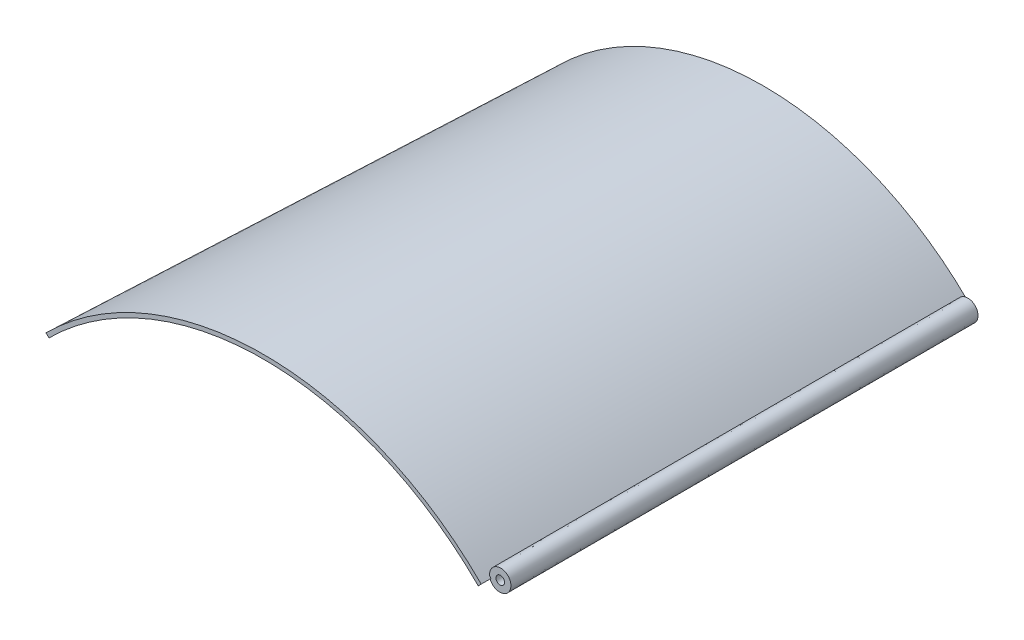
ISO-10303-21;
HEADER;
FILE_DESCRIPTION(('STEP AP214'),'2;1');
FILE_NAME('part.step','',(''),(''),'','','');
FILE_SCHEMA(('AUTOMOTIVE_DESIGN { 1 0 10303 214 1 1 1 1 }'));
ENDSEC;
DATA;
#1=APPLICATION_CONTEXT('core data for automotive mechanical design processes');
#2=APPLICATION_PROTOCOL_DEFINITION('international standard','automotive_design',2000,#1);
#3=PRODUCT_CONTEXT('',#1,'mechanical');
#4=PRODUCT('Part','Part','',(#3));
#5=PRODUCT_RELATED_PRODUCT_CATEGORY('part','',(#4));
#6=PRODUCT_DEFINITION_FORMATION('','',#4);
#7=PRODUCT_DEFINITION_CONTEXT('part definition',#1,'design');
#8=PRODUCT_DEFINITION('design','',#6,#7);
#9=PRODUCT_DEFINITION_SHAPE('','',#8);
#10=(LENGTH_UNIT() NAMED_UNIT(*) SI_UNIT(.MILLI.,.METRE.));
#11=(NAMED_UNIT(*) PLANE_ANGLE_UNIT() SI_UNIT($,.RADIAN.));
#12=(NAMED_UNIT(*) SI_UNIT($,.STERADIAN.) SOLID_ANGLE_UNIT());
#13=UNCERTAINTY_MEASURE_WITH_UNIT(LENGTH_MEASURE(1.E-05),#10,'distance_accuracy_value','');
#14=(GEOMETRIC_REPRESENTATION_CONTEXT(3) GLOBAL_UNCERTAINTY_ASSIGNED_CONTEXT((#13)) GLOBAL_UNIT_ASSIGNED_CONTEXT((#10,
#11,#12)) REPRESENTATION_CONTEXT('',''));
#15=CARTESIAN_POINT('',(0.,0.,0.));
#16=DIRECTION('',(0.,0.,1.));
#17=DIRECTION('',(1.,0.,0.));
#18=AXIS2_PLACEMENT_3D('',#15,#16,#17);
#19=CARTESIAN_POINT('',(-98.5933127144027,98.5933127144027,-120.));
#20=DIRECTION('',(0.,0.,-1.));
#21=DIRECTION('',(-1.,0.,0.));
#22=AXIS2_PLACEMENT_3D('',#19,#20,#21);
#23=PLANE('',#22);
#24=CARTESIAN_POINT('',(0.,0.,-120.));
#25=DIRECTION('',(0.,0.,-1.));
#26=DIRECTION('',(-1.,0.,0.));
#27=AXIS2_PLACEMENT_3D('',#24,#25,#26);
#28=CIRCLE('',#27,137.432);
#29=CARTESIAN_POINT('',(-97.1790991520296,97.1790991520296,-120.));
#30=VERTEX_POINT('',#29);
#31=CARTESIAN_POINT('',(97.1790991520296,97.1790991520296,-120.));
#32=VERTEX_POINT('',#31);
#33=EDGE_CURVE('E68',#30,#32,#28,.T.);
#34=ORIENTED_EDGE('',*,*,#33,.F.);
#35=DIRECTION('',(-0.707106781186548,0.707106781186548,0.));
#36=VECTOR('',#35,1.);
#37=CARTESIAN_POINT('',(-98.5933127144027,98.5933127144027,-120.));
#38=LINE('',#37,#36);
#39=CARTESIAN_POINT('',(-98.5933127144027,98.5933127144027,-120.));
#40=VERTEX_POINT('',#39);
#41=EDGE_CURVE('E209',#30,#40,#38,.T.);
#42=ORIENTED_EDGE('',*,*,#41,.T.);
#43=CARTESIAN_POINT('',(0.,0.,-120.));
#44=DIRECTION('',(0.,0.,-1.));
#45=DIRECTION('',(-1.,0.,0.));
#46=AXIS2_PLACEMENT_3D('',#43,#44,#45);
#47=CIRCLE('',#46,139.432);
#48=CARTESIAN_POINT('',(98.5933127144027,98.5933127144027,-120.));
#49=VERTEX_POINT('',#48);
#50=EDGE_CURVE('E208',#40,#49,#47,.T.);
#51=ORIENTED_EDGE('',*,*,#50,.T.);
#52=DIRECTION('',(0.707106781186548,0.707106781186548,0.));
#53=VECTOR('',#52,1.);
#54=CARTESIAN_POINT('',(98.5933127144027,98.5933127144027,-120.));
#55=LINE('',#54,#53);
#56=EDGE_CURVE('E169',#32,#49,#55,.T.);
#57=ORIENTED_EDGE('',*,*,#56,.F.);
#58=EDGE_LOOP('',(#34,#42,#51,#57));
#59=FACE_BOUND('',#58,.T.);
#60=ADVANCED_FACE('F41',(#59),#23,.T.);
#61=CARTESIAN_POINT('',(0.,0.,120.));
#62=DIRECTION('',(0.,0.,1.));
#63=DIRECTION('',(1.,0.,0.));
#64=AXIS2_PLACEMENT_3D('',#61,#62,#63);
#65=CONICAL_SURFACE('',#64,145.771,0.0347318608850217);
#66=CARTESIAN_POINT('',(0.,0.,120.));
#67=DIRECTION('',(0.,0.,-1.));
#68=DIRECTION('',(-1.,0.,0.));
#69=AXIS2_PLACEMENT_3D('',#66,#67,#68);
#70=CIRCLE('',#69,145.771);
#71=CARTESIAN_POINT('',(-103.075662600344,103.075662600344,120.));
#72=VERTEX_POINT('',#71);
#73=CARTESIAN_POINT('',(103.075662600344,103.075662600344,120.));
#74=VERTEX_POINT('',#73);
#75=EDGE_CURVE('E193',#72,#74,#70,.T.);
#76=ORIENTED_EDGE('',*,*,#75,.F.);
#77=DIRECTION('',(0.0245541970300258,-0.0245541970300258,-0.999396909549165));
#78=VECTOR('',#77,1.);
#79=CARTESIAN_POINT('',(-97.1790991520296,97.1790991520296,-120.));
#80=LINE('',#79,#78);
#81=EDGE_CURVE('E195',#72,#30,#80,.T.);
#82=ORIENTED_EDGE('',*,*,#81,.T.);
#83=ORIENTED_EDGE('',*,*,#33,.T.);
#84=DIRECTION('',(-0.0245541970300258,-0.0245541970300258,-0.999396909549165));
#85=VECTOR('',#84,1.);
#86=CARTESIAN_POINT('',(97.1790991520296,97.1790991520296,-120.));
#87=LINE('',#86,#85);
#88=EDGE_CURVE('E200',#74,#32,#87,.T.);
#89=ORIENTED_EDGE('',*,*,#88,.F.);
#90=EDGE_LOOP('',(#76,#82,#83,#89));
#91=FACE_BOUND('',#90,.T.);
#92=ADVANCED_FACE('F43',(#91),#65,.F.);
#93=CARTESIAN_POINT('',(-103.075662600344,103.075662600344,120.));
#94=DIRECTION('',(0.,0.,1.));
#95=DIRECTION('',(1.,0.,0.));
#96=AXIS2_PLACEMENT_3D('',#93,#94,#95);
#97=PLANE('',#96);
#98=CARTESIAN_POINT('',(0.,0.,120.));
#99=DIRECTION('',(0.,0.,-1.));
#100=DIRECTION('',(-1.,0.,0.));
#101=AXIS2_PLACEMENT_3D('',#98,#99,#100);
#102=CIRCLE('',#101,147.771);
#103=CARTESIAN_POINT('',(-104.489876162717,104.489876162717,120.));
#104=VERTEX_POINT('',#103);
#105=CARTESIAN_POINT('',(104.489876162717,104.489876162717,120.));
#106=VERTEX_POINT('',#105);
#107=EDGE_CURVE('E198',#104,#106,#102,.T.);
#108=ORIENTED_EDGE('',*,*,#107,.F.);
#109=DIRECTION('',(0.707106781186548,-0.707106781186548,0.));
#110=VECTOR('',#109,1.);
#111=CARTESIAN_POINT('',(-103.075662600344,103.075662600344,120.));
#112=LINE('',#111,#110);
#113=EDGE_CURVE('E205',#104,#72,#112,.T.);
#114=ORIENTED_EDGE('',*,*,#113,.T.);
#115=ORIENTED_EDGE('',*,*,#75,.T.);
#116=DIRECTION('',(-0.707106781186548,-0.707106781186548,0.));
#117=VECTOR('',#116,1.);
#118=CARTESIAN_POINT('',(103.075662600344,103.075662600344,120.));
#119=LINE('',#118,#117);
#120=EDGE_CURVE('E220',#106,#74,#119,.T.);
#121=ORIENTED_EDGE('',*,*,#120,.F.);
#122=EDGE_LOOP('',(#108,#114,#115,#121));
#123=FACE_BOUND('',#122,.T.);
#124=ADVANCED_FACE('F159',(#123),#97,.T.);
#125=CARTESIAN_POINT('',(0.,0.,-120.));
#126=DIRECTION('',(0.,0.,1.));
#127=DIRECTION('',(1.,0.,0.));
#128=AXIS2_PLACEMENT_3D('',#125,#126,#127);
#129=CONICAL_SURFACE('',#128,139.432,0.0347318608850216);
#130=CARTESIAN_POINT('',(98.8458656292798,98.5931127144027,-114.861114639131));
#131=CARTESIAN_POINT('',(98.6902636623232,98.7491180915949,-114.86102281092));
#132=CARTESIAN_POINT('',(98.5342945693662,98.9047537976969,-114.860913149327));
#133=CARTESIAN_POINT('',(98.2216221314518,99.21528586772,-114.860658159373));
#134=CARTESIAN_POINT('',(98.0649187864943,99.3701822316413,-114.860512831013));
#135=CARTESIAN_POINT('',(97.9078483155365,99.5247089244722,-114.86034966927));
#136=B_SPLINE_CURVE_WITH_KNOTS('',3,(#130,#131,#132,#133,#134,#135),.UNSPECIFIED.,.F.,.F.,(4,2,
4),(0.,0.66101405959026,1.32202811917969),.UNSPECIFIED.);
#137=CARTESIAN_POINT('',(98.7195719891886,98.7195719891886,-114.86103622657));
#138=VERTEX_POINT('',#137);
#139=CARTESIAN_POINT('',(97.9545333397463,99.4787584406209,-114.860397658878));
#140=VERTEX_POINT('',#139);
#141=EDGE_CURVE('E161',#138,#140,#136,.T.);
#142=ORIENTED_EDGE('',*,*,#141,.F.);
#143=DIRECTION('',(0.0245541970300258,0.0245541970300258,0.999396909549165));
#144=VECTOR('',#143,1.);
#145=CARTESIAN_POINT('',(104.489876162717,104.489876162717,120.));
#146=LINE('',#145,#144);
#147=EDGE_CURVE('E219',#49,#138,#146,.T.);
#148=ORIENTED_EDGE('',*,*,#147,.F.);
#149=ORIENTED_EDGE('',*,*,#50,.F.);
#150=DIRECTION('',(-0.0245541970300258,0.0245541970300258,0.999396909549165));
#151=VECTOR('',#150,1.);
#152=CARTESIAN_POINT('',(-104.489876162717,104.489876162717,120.));
#153=LINE('',#152,#151);
#154=EDGE_CURVE('E210',#40,#104,#153,.T.);
#155=ORIENTED_EDGE('',*,*,#154,.T.);
#156=ORIENTED_EDGE('',*,*,#107,.T.);
#157=CARTESIAN_POINT('',(104.370430439296,104.370430439296,115.138359169307));
#158=VERTEX_POINT('',#157);
#159=EDGE_CURVE('E217',#158,#106,#146,.T.);
#160=ORIENTED_EDGE('',*,*,#159,.F.);
#161=CARTESIAN_POINT('',(103.617187766271,105.118305955875,115.138978003702));
#162=CARTESIAN_POINT('',(103.763271348021,104.97430141803,115.138833204453));
#163=CARTESIAN_POINT('',(103.9090538386,104.829993963779,115.138703018824));
#164=CARTESIAN_POINT('',(104.200016637415,104.540773222462,115.138471874805));
#165=CARTESIAN_POINT('',(104.345196945652,104.395859935397,115.138370916416));
#166=CARTESIAN_POINT('',(104.490076162717,104.250643731925,115.138284571647));
#167=B_SPLINE_CURVE_WITH_KNOTS('',3,(#161,#162,#163,#164,#165,#166),.UNSPECIFIED.,.F.,.F.,(4,2,
4),(0.,0.615381780476349,1.23076356095324),.UNSPECIFIED.);
#168=CARTESIAN_POINT('',(103.658835272652,105.07723491807,115.138937103943));
#169=VERTEX_POINT('',#168);
#170=EDGE_CURVE('E64',#169,#158,#167,.T.);
#171=ORIENTED_EDGE('',*,*,#170,.F.);
#172=CARTESIAN_POINT('',(97.3755047987656,98.9104210348934,-138.207859424949));
#173=CARTESIAN_POINT('',(97.4581103003111,98.9915020037982,-134.877047240761));
#174=CARTESIAN_POINT('',(97.5407159218484,99.072582794962,-131.546235055223));
#175=CARTESIAN_POINT('',(97.9537446279283,99.4779858657402,-114.892174120825));
#176=CARTESIAN_POINT('',(98.2841695076501,99.8023054902312,-101.568925351854));
#177=CARTESIAN_POINT('',(99.9363033803198,101.423889686499,-34.9526814029434));
#178=CARTESIAN_POINT('',(101.258040795447,102.721112479713,18.3403140890973));
#179=CARTESIAN_POINT('',(103.130203671508,104.558451832622,93.8250244267583));
#180=CARTESIAN_POINT('',(103.680605015394,105.098603088092,116.016739026021));
#181=CARTESIAN_POINT('',(104.231011335948,105.63874725241,138.208453674444));
#182=B_SPLINE_CURVE_WITH_KNOTS('',3,(#172,#173,#174,#175,#176,#177,#178,#179,#180,#181),
.UNSPECIFIED.,.F.,.F.,(4,2,2,2,4),(0.,9.99846830212765,49.9923415106395,209.96783434476,
276.583163788201),.UNSPECIFIED.);
#183=EDGE_CURVE('E117',#140,#169,#182,.T.);
#184=ORIENTED_EDGE('',*,*,#183,.F.);
#185=EDGE_LOOP('',(#142,#148,#149,#155,#156,#160,#171,#184));
#186=FACE_BOUND('',#185,.T.);
#187=ADVANCED_FACE('F151',(#186),#129,.T.);
#188=CARTESIAN_POINT('',(0.,0.,0.));
#189=DIRECTION('',(-0.707106781186547,-0.707106781186547,0.));
#190=DIRECTION('',(0.,0.,1.));
#191=AXIS2_PLACEMENT_3D('',#188,#189,#190);
#192=PLANE('',#191);
#193=ORIENTED_EDGE('',*,*,#41,.F.);
#194=ORIENTED_EDGE('',*,*,#81,.F.);
#195=ORIENTED_EDGE('',*,*,#113,.F.);
#196=ORIENTED_EDGE('',*,*,#154,.F.);
#197=EDGE_LOOP('',(#193,#194,#195,#196));
#198=FACE_BOUND('',#197,.T.);
#199=ADVANCED_FACE('F158',(#198),#192,.T.);
#200=CARTESIAN_POINT('',(0.,0.,0.));
#201=DIRECTION('',(-0.707106781186547,0.707106781186547,0.));
#202=DIRECTION('',(0.,0.,1.));
#203=AXIS2_PLACEMENT_3D('',#200,#201,#202);
#204=PLANE('',#203);
#205=ORIENTED_EDGE('',*,*,#147,.T.);
#206=CARTESIAN_POINT('',(104.490076162717,104.490076162717,-115.143913152076));
#207=CARTESIAN_POINT('',(103.40255231137,103.40255231137,-115.090566172756));
#208=CARTESIAN_POINT('',(102.315027988011,102.315027988011,-115.037238452043));
#209=CARTESIAN_POINT('',(100.155642944185,100.155642944185,-114.931389375069));
#210=CARTESIAN_POINT('',(99.0837822372179,99.0837822372179,-114.878867468005));
#211=CARTESIAN_POINT('',(98.0119210717384,98.0119210717384,-114.826364268749));
#212=B_SPLINE_CURVE_WITH_KNOTS('',3,(#206,#207,#208,#209,#210,#211),.UNSPECIFIED.,.F.,.F.,(4,2,
4),(0.,4.61674770615908,9.16699645859215),.UNSPECIFIED.);
#213=CARTESIAN_POINT('',(98.2761149985119,98.2761149985119,-114.839308603109));
#214=VERTEX_POINT('',#213);
#215=EDGE_CURVE('E11',#138,#214,#212,.T.);
#216=ORIENTED_EDGE('',*,*,#215,.T.);
#217=CARTESIAN_POINT('',(10.4422679309313,10.4422679309313,-3831.35145269981));
#218=DIRECTION('',(-0.707106781186547,0.707106781186547,0.));
#219=DIRECTION('',(0.0244955678424094,0.0244955678424094,0.999399787028272));
#220=AXIS2_PLACEMENT_3D('',#217,#218,#219);
#221=ELLIPSE('',#220,10504.8045986152,4.92490880972643);
#222=CARTESIAN_POINT('',(103.943370158194,103.943370158194,115.159283533857));
#223=VERTEX_POINT('',#222);
#224=EDGE_CURVE('E54',#214,#223,#221,.T.);
#225=ORIENTED_EDGE('',*,*,#224,.T.);
#226=CARTESIAN_POINT('',(103.647207686546,103.647207686546,115.173794249495));
#227=CARTESIAN_POINT('',(103.787685767983,103.787685767982,115.166911445822));
#228=CARTESIAN_POINT('',(103.928163848382,103.928163848382,115.16002859981));
#229=CARTESIAN_POINT('',(104.209120007105,104.209120007105,115.146262823105));
#230=CARTESIAN_POINT('',(104.34959808543,104.34959808543,115.139379892412));
#231=CARTESIAN_POINT('',(104.490076162717,104.490076162717,115.13249691938));
#232=B_SPLINE_CURVE_WITH_KNOTS('',3,(#226,#227,#228,#229,#230,#231),.UNSPECIFIED.,.F.,.F.,(4,2,
4),(0.,0.596355599814579,1.19271119962918),.UNSPECIFIED.);
#233=EDGE_CURVE('E102',#223,#158,#232,.T.);
#234=ORIENTED_EDGE('',*,*,#233,.T.);
#235=ORIENTED_EDGE('',*,*,#159,.T.);
#236=ORIENTED_EDGE('',*,*,#120,.T.);
#237=ORIENTED_EDGE('',*,*,#88,.T.);
#238=ORIENTED_EDGE('',*,*,#56,.T.);
#239=EDGE_LOOP('',(#205,#216,#225,#234,#235,#236,#237,#238));
#240=FACE_BOUND('',#239,.T.);
#241=ADVANCED_FACE('F124',(#240),#204,.F.);
#242=CARTESIAN_POINT('',(102.906282739015,100.15589024601,-114.999725041847));
#243=DIRECTION('',(-0.0248273473656472,-0.0241637829262545,-0.999399677014896));
#244=DIRECTION('',(-0.999691573789313,0.,0.0248345987414281));
#245=AXIS2_PLACEMENT_3D('',#242,#243,#244);
#246=CONICAL_SURFACE('',#245,1.99955786821047,1.57077728589374);
#247=ORIENTED_EDGE('',*,*,#215,.F.);
#248=ORIENTED_EDGE('',*,*,#141,.T.);
#249=CARTESIAN_POINT('',(102.906281320707,100.15588886561,-114.999782134375));
#250=DIRECTION('',(-0.0248273473656472,-0.0241637829262545,-0.999399677014896));
#251=DIRECTION('',(-0.999691573789313,0.,0.0248345987414281));
#252=AXIS2_PLACEMENT_3D('',#249,#250,#251);
#253=CIRCLE('',#252,4.99977416604044);
#254=EDGE_CURVE('E118',#140,#214,#253,.T.);
#255=ORIENTED_EDGE('',*,*,#254,.T.);
#256=EDGE_LOOP('',(#247,#248,#255));
#257=FACE_BOUND('',#256,.T.);
#258=CARTESIAN_POINT('',(102.906282739015,100.15589024601,-114.999725041847));
#259=DIRECTION('',(-0.0248273473656472,-0.0241637829262545,-0.999399677014896));
#260=DIRECTION('',(-0.999691573789313,0.,0.0248345987414281));
#261=AXIS2_PLACEMENT_3D('',#258,#259,#260);
#262=CIRCLE('',#261,1.99955786821048);
#263=CARTESIAN_POINT('',(100.90734158686,100.15589024601,-114.95006682453));
#264=VERTEX_POINT('',#263);
#265=EDGE_CURVE('E266',#264,#264,#262,.T.);
#266=ORIENTED_EDGE('',*,*,#265,.F.);
#267=EDGE_LOOP('',(#266));
#268=FACE_BOUND('',#267,.T.);
#269=ADVANCED_FACE('F171',(#257,#268),#246,.F.);
#270=CARTESIAN_POINT('',(102.906281320707,100.15588886561,-114.999782134375));
#271=DIRECTION('',(0.0248273473656472,0.0241637829262545,0.999399677014896));
#272=DIRECTION('',(0.999691573789313,0.,-0.0248345987414281));
#273=AXIS2_PLACEMENT_3D('',#270,#271,#272);
#274=CONICAL_SURFACE('',#273,4.99977416604044,1.90409011517953E-05);
#275=ORIENTED_EDGE('',*,*,#254,.F.);
#276=ORIENTED_EDGE('',*,*,#183,.T.);
#277=CARTESIAN_POINT('',(108.620001458726,105.716897501897,115.000224567557));
#278=DIRECTION('',(-0.0248273473656472,-0.0241637829262545,-0.999399677014896));
#279=DIRECTION('',(-0.999691573789313,0.,0.0248345987414281));
#280=AXIS2_PLACEMENT_3D('',#277,#278,#279);
#281=CIRCLE('',#280,5.00415620407164);
#282=EDGE_CURVE('E108',#169,#223,#281,.T.);
#283=ORIENTED_EDGE('',*,*,#282,.T.);
#284=ORIENTED_EDGE('',*,*,#224,.F.);
#285=EDGE_LOOP('',(#275,#276,#283,#284));
#286=FACE_BOUND('',#285,.T.);
#287=ADVANCED_FACE('F114',(#286),#274,.T.);
#288=CARTESIAN_POINT('',(108.620001458726,105.716897501897,115.000224567557));
#289=DIRECTION('',(-0.0248273473656472,-0.0241637829262545,-0.999399677014896));
#290=DIRECTION('',(-0.999691573789313,0.,0.0248345987414281));
#291=AXIS2_PLACEMENT_3D('',#288,#289,#290);
#292=CONICAL_SURFACE('',#291,5.00415620407165,1.57077728589374);
#293=CARTESIAN_POINT('',(108.620002877034,105.716898882297,115.000281660085));
#294=DIRECTION('',(-0.0248273473656472,-0.0241637829262545,-0.999399677014896));
#295=DIRECTION('',(-0.999691573789313,0.,0.0248345987414281));
#296=AXIS2_PLACEMENT_3D('',#293,#294,#295);
#297=CIRCLE('',#296,2.0039399062416);
#298=CARTESIAN_POINT('',(106.616681038384,105.716898882297,115.050048703558));
#299=VERTEX_POINT('',#298);
#300=EDGE_CURVE('E119',#299,#299,#297,.T.);
#301=ORIENTED_EDGE('',*,*,#300,.T.);
#302=EDGE_LOOP('',(#301));
#303=FACE_BOUND('',#302,.T.);
#304=ORIENTED_EDGE('',*,*,#282,.F.);
#305=ORIENTED_EDGE('',*,*,#170,.T.);
#306=ORIENTED_EDGE('',*,*,#233,.F.);
#307=EDGE_LOOP('',(#304,#305,#306));
#308=FACE_BOUND('',#307,.T.);
#309=ADVANCED_FACE('F110',(#303,#308),#292,.T.);
#310=CARTESIAN_POINT('',(108.620002877034,105.716898882297,115.000281660085));
#311=DIRECTION('',(0.0248273473656472,0.0241637829262545,0.999399677014896));
#312=DIRECTION('',(0.999691573789313,0.,-0.0248345987414281));
#313=AXIS2_PLACEMENT_3D('',#310,#311,#312);
#314=CONICAL_SURFACE('',#313,2.0039399062416,1.90409011514543E-05);
#315=ORIENTED_EDGE('',*,*,#265,.T.);
#316=EDGE_LOOP('',(#315));
#317=FACE_BOUND('',#316,.T.);
#318=ORIENTED_EDGE('',*,*,#300,.F.);
#319=EDGE_LOOP('',(#318));
#320=FACE_BOUND('',#319,.T.);
#321=ADVANCED_FACE('F140',(#317,#320),#314,.F.);
#322=CLOSED_SHELL('',(#60,#92,#124,#187,#199,#241,#269,#287,#309,#321));
#323=MANIFOLD_SOLID_BREP('B2',#322);
#324=ADVANCED_BREP_SHAPE_REPRESENTATION('',(#18,#323),#14);
#325=SHAPE_DEFINITION_REPRESENTATION(#9,#324);
ENDSEC;
END-ISO-10303-21;
